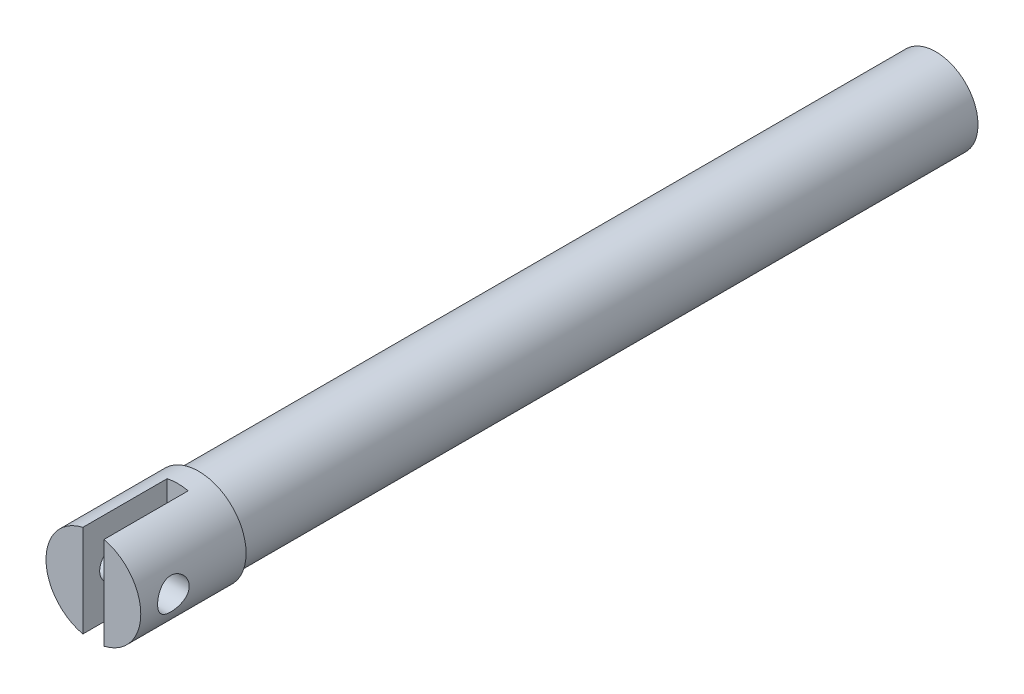
ISO-10303-21;
HEADER;
FILE_DESCRIPTION(('STEP AP214'),'2;1');
FILE_NAME('part.step','',(''),(''),'','','');
FILE_SCHEMA(('AUTOMOTIVE_DESIGN { 1 0 10303 214 1 1 1 1 }'));
ENDSEC;
DATA;
#1=APPLICATION_CONTEXT('core data for automotive mechanical design processes');
#2=APPLICATION_PROTOCOL_DEFINITION('international standard','automotive_design',2000,#1);
#3=PRODUCT_CONTEXT('',#1,'mechanical');
#4=PRODUCT('Part','Part','',(#3));
#5=PRODUCT_RELATED_PRODUCT_CATEGORY('part','',(#4));
#6=PRODUCT_DEFINITION_FORMATION('','',#4);
#7=PRODUCT_DEFINITION_CONTEXT('part definition',#1,'design');
#8=PRODUCT_DEFINITION('design','',#6,#7);
#9=PRODUCT_DEFINITION_SHAPE('','',#8);
#10=(LENGTH_UNIT() NAMED_UNIT(*) SI_UNIT(.MILLI.,.METRE.));
#11=(NAMED_UNIT(*) PLANE_ANGLE_UNIT() SI_UNIT($,.RADIAN.));
#12=(NAMED_UNIT(*) SI_UNIT($,.STERADIAN.) SOLID_ANGLE_UNIT());
#13=UNCERTAINTY_MEASURE_WITH_UNIT(LENGTH_MEASURE(1.E-05),#10,'distance_accuracy_value','');
#14=(GEOMETRIC_REPRESENTATION_CONTEXT(3) GLOBAL_UNCERTAINTY_ASSIGNED_CONTEXT((#13)) GLOBAL_UNIT_ASSIGNED_CONTEXT((#10,
#11,#12)) REPRESENTATION_CONTEXT('',''));
#15=CARTESIAN_POINT('',(0.,0.,0.));
#16=DIRECTION('',(0.,0.,1.));
#17=DIRECTION('',(1.,0.,0.));
#18=AXIS2_PLACEMENT_3D('',#15,#16,#17);
#19=CARTESIAN_POINT('',(0.,0.,70.));
#20=DIRECTION('',(0.,0.,1.));
#21=DIRECTION('',(1.,0.,0.));
#22=AXIS2_PLACEMENT_3D('',#19,#20,#21);
#23=CYLINDRICAL_SURFACE('',#22,4.5);
#24=CARTESIAN_POINT('',(-4.5,0.,75.4014187719392));
#25=CARTESIAN_POINT('',(-4.50000022951416,-0.0818450443300849,75.4014183913418));
#26=CARTESIAN_POINT('',(-4.49774654261317,-0.163687791807825,75.4081391711301));
#27=CARTESIAN_POINT('',(-4.48897815304921,-0.324962641309459,75.4347624351651));
#28=CARTESIAN_POINT('',(-4.48246300803229,-0.404394492178227,75.4546662878626));
#29=CARTESIAN_POINT('',(-4.46587961859664,-0.558499184252665,75.5068976370153));
#30=CARTESIAN_POINT('',(-4.4558173159628,-0.633179738829053,75.5392043656281));
#31=CARTESIAN_POINT('',(-4.43316668576013,-0.776062405207988,75.6152305311968));
#32=CARTESIAN_POINT('',(-4.42057786001667,-0.844263235438059,75.6589522194432));
#33=CARTESIAN_POINT('',(-4.39371141664507,-0.9746125125334,75.7581574792274));
#34=CARTESIAN_POINT('',(-4.37939334695677,-1.03650555044747,75.81396562333));
#35=CARTESIAN_POINT('',(-4.35090472174682,-1.15024903905313,75.9350695039991));
#36=CARTESIAN_POINT('',(-4.33673419935823,-1.20209727823419,76.000367324332));
#37=CARTESIAN_POINT('',(-4.30969998715911,-1.29573741334179,76.1408964447339));
#38=CARTESIAN_POINT('',(-4.29688558913532,-1.33719728733155,76.2163593815374));
#39=CARTESIAN_POINT('',(-4.27462958127902,-1.40672831081658,76.3736829136271));
#40=CARTESIAN_POINT('',(-4.26518694241118,-1.43480354608014,76.4555415476833));
#41=CARTESIAN_POINT('',(-4.25116954904066,-1.47581019226374,76.6204286041843));
#42=CARTESIAN_POINT('',(-4.24644143654417,-1.48922017240765,76.7033245846728));
#43=CARTESIAN_POINT('',(-4.24193484944261,-1.50201168500171,76.8703144031731));
#44=CARTESIAN_POINT('',(-4.24215484534095,-1.50139755240707,76.954407863003));
#45=CARTESIAN_POINT('',(-4.2473852251227,-1.48652985555512,77.1173237176053));
#46=CARTESIAN_POINT('',(-4.25217623801299,-1.47290086975049,77.1962113763178));
#47=CARTESIAN_POINT('',(-4.26564986586826,-1.43340924427412,77.3505089013495));
#48=CARTESIAN_POINT('',(-4.27433294676161,-1.4075451398878,77.4259183500918));
#49=CARTESIAN_POINT('',(-4.29476866696873,-1.34390858709032,77.5725378963265));
#50=CARTESIAN_POINT('',(-4.30656848689676,-1.30595107306089,77.6436608101435));
#51=CARTESIAN_POINT('',(-4.3318883786359,-1.21933365945471,77.7787251343588));
#52=CARTESIAN_POINT('',(-4.34540894685695,-1.17067066854601,77.8426644623393));
#53=CARTESIAN_POINT('',(-4.37350993751611,-1.06102399902336,77.9650561691804));
#54=CARTESIAN_POINT('',(-4.38810884032264,-0.99952972511447,78.0230478137028));
#55=CARTESIAN_POINT('',(-4.41610407580555,-0.867509354955093,78.1280156719343));
#56=CARTESIAN_POINT('',(-4.42950029307101,-0.796982393491217,78.174990829186));
#57=CARTESIAN_POINT('',(-4.45375661906691,-0.647921419569393,78.2569632222918));
#58=CARTESIAN_POINT('',(-4.46459025012059,-0.569314914624495,78.2918370089503));
#59=CARTESIAN_POINT('',(-4.48230850716652,-0.406903625046752,78.3477235328728));
#60=CARTESIAN_POINT('',(-4.48919450482319,-0.323100657232423,78.3687410850744));
#61=CARTESIAN_POINT('',(-4.49801440607161,-0.156575744293951,78.3955022709728));
#62=CARTESIAN_POINT('',(-4.50015002750592,-0.0739643997972646,78.4018684856984));
#63=CARTESIAN_POINT('',(-4.49983354042241,0.0911626049403602,78.4009197615415));
#64=CARTESIAN_POINT('',(-4.49738220629043,0.173678278979479,78.3936071319694));
#65=CARTESIAN_POINT('',(-4.48830037075656,0.333779799456385,78.3660009103353));
#66=CARTESIAN_POINT('',(-4.48179298066788,0.411439210252266,78.346089462865));
#67=CARTESIAN_POINT('',(-4.46537770245105,0.562283937869361,78.2943286052391));
#68=CARTESIAN_POINT('',(-4.45546938070013,0.635468682762911,78.2624776727376));
#69=CARTESIAN_POINT('',(-4.43293396930935,0.77743244458991,78.186813124178));
#70=CARTESIAN_POINT('',(-4.42024222133679,0.846044938825718,78.1427068820145));
#71=CARTESIAN_POINT('',(-4.39357880874394,0.975097245203378,78.044127546919));
#72=CARTESIAN_POINT('',(-4.37960675390741,1.03553455169337,77.9896512878916));
#73=CARTESIAN_POINT('',(-4.35115271970667,1.14937876170945,77.8689506454294));
#74=CARTESIAN_POINT('',(-4.33667641631142,1.20234145386865,77.8023049315489));
#75=CARTESIAN_POINT('',(-4.30949959942063,1.29638628348536,77.6607614202229));
#76=CARTESIAN_POINT('',(-4.29679910073004,1.33746832189652,77.5858635539881));
#77=CARTESIAN_POINT('',(-4.27473587687075,1.40639539562454,77.4299092490044));
#78=CARTESIAN_POINT('',(-4.26536641189468,1.43426719824753,77.3488656531861));
#79=CARTESIAN_POINT('',(-4.25116248459674,1.47584200013903,77.182850796873));
#80=CARTESIAN_POINT('',(-4.24632597935459,1.48955138243091,77.0978813238327));
#81=CARTESIAN_POINT('',(-4.24196788311266,1.50191442371601,76.9311231278779));
#82=CARTESIAN_POINT('',(-4.24218600386123,1.5013053859626,76.849395261509));
#83=CARTESIAN_POINT('',(-4.24726904735801,1.48686344017304,76.6872711595561));
#84=CARTESIAN_POINT('',(-4.25213369354043,1.47303131918787,76.6068748450066));
#85=CARTESIAN_POINT('',(-4.26576786457338,1.43305771969401,76.4512152774355));
#86=CARTESIAN_POINT('',(-4.27446147033717,1.40715501902326,76.3758835344325));
#87=CARTESIAN_POINT('',(-4.29474598227703,1.34396904863961,76.2305776615318));
#88=CARTESIAN_POINT('',(-4.3063375314509,1.3066832528307,76.1606047251572));
#89=CARTESIAN_POINT('',(-4.33174243839069,1.21989103887514,76.0246932670549));
#90=CARTESIAN_POINT('',(-4.34563067463206,1.16992236414686,75.9590640190917));
#91=CARTESIAN_POINT('',(-4.37375034424879,1.05996432470347,75.8368840518629));
#92=CARTESIAN_POINT('',(-4.38798187368559,0.999972126677219,75.7803359084071));
#93=CARTESIAN_POINT('',(-4.41585045788316,0.86886233538103,75.6757021535055));
#94=CARTESIAN_POINT('',(-4.42944272701885,0.79740227024959,75.6280322503127));
#95=CARTESIAN_POINT('',(-4.45388986758918,0.647036036109931,75.5454331286633));
#96=CARTESIAN_POINT('',(-4.46474543861895,0.568131777198515,75.5105006530562));
#97=CARTESIAN_POINT('',(-4.48208272602813,0.408740470801455,75.4558363232062));
#98=CARTESIAN_POINT('',(-4.48873818633784,0.328481636514606,75.4354950725442));
#99=CARTESIAN_POINT('',(-4.49769610596333,0.165480624015367,75.4082883509235));
#100=CARTESIAN_POINT('',(-4.49999976797857,0.0827391383531179,75.4014191566944));
#101=CARTESIAN_POINT('',(-4.5,0.,75.4014187719392));
#102=B_SPLINE_CURVE_WITH_KNOTS('',3,(#24,#25,#26,#27,#28,#29,#30,#31,#32,#33,#34,#35,#36,#37,
#38,#39,#40,#41,#42,#43,#44,#45,#46,#47,#48,#49,#50,#51,#52,#53,#54,#55,#56,#57,#58,#59,#60,#61,
#62,#63,#64,#65,#66,#67,#68,#69,#70,#71,#72,#73,#74,#75,#76,#77,#78,#79,#80,#81,#82,#83,#84,#85,
#86,#87,#88,#89,#90,#91,#92,#93,#94,#95,#96,#97,#98,#99,#100,#101),.UNSPECIFIED.,.T.,.F.,(4,2,2,
2,2,2,2,2,2,2,2,2,2,2,2,2,2,2,2,2,2,2,2,2,2,2,2,2,2,2,2,2,2,2,2,2,2,2,4),(0.,0.245230659039017,
0.490486777901282,0.735334009305413,0.980229566698657,1.23277026424134,1.48536649931295,
1.74522577235206,2.0050056703925,2.25602888612761,2.50697450981229,2.74645239826921,
2.98595896283222,3.22932256732695,3.47275653837309,3.72889958717049,3.98506718949927,
4.24377608475536,4.50239503315812,4.74980374762754,4.99717069746265,5.23737236967319,
5.47760467926155,5.72415599765604,5.97078271232836,6.22861534321126,6.48645012352494,
6.74376020740154,7.0009542705876,7.24493499096386,7.48890119027063,7.72823380620626,
7.96761957263967,8.21745100037706,8.46735316685668,8.72699491252649,8.98657021728684,
9.2345483756072,9.48245799057208),.UNSPECIFIED.);
#103=CARTESIAN_POINT('',(-4.5,0.,75.4014187719392));
#104=VERTEX_POINT('',#103);
#105=EDGE_CURVE('E116',#104,#104,#102,.T.);
#106=ORIENTED_EDGE('',*,*,#105,.F.);
#107=EDGE_LOOP('',(#106));
#108=FACE_BOUND('',#107,.T.);
#109=CARTESIAN_POINT('',(4.5,0.,75.4014187719392));
#110=CARTESIAN_POINT('',(4.50000022951416,0.0818450443300849,75.4014183913418));
#111=CARTESIAN_POINT('',(4.49774654261317,0.163687791807825,75.4081391711301));
#112=CARTESIAN_POINT('',(4.48897815304921,0.324962641309459,75.4347624351651));
#113=CARTESIAN_POINT('',(4.48246300803229,0.404394492178227,75.4546662878626));
#114=CARTESIAN_POINT('',(4.46587961859664,0.558499184252665,75.5068976370153));
#115=CARTESIAN_POINT('',(4.4558173159628,0.633179738829053,75.5392043656281));
#116=CARTESIAN_POINT('',(4.43316668576013,0.776062405207988,75.6152305311968));
#117=CARTESIAN_POINT('',(4.42057786001667,0.844263235438059,75.6589522194432));
#118=CARTESIAN_POINT('',(4.39371141664507,0.9746125125334,75.7581574792274));
#119=CARTESIAN_POINT('',(4.37939334695677,1.03650555044747,75.81396562333));
#120=CARTESIAN_POINT('',(4.35090472174682,1.15024903905313,75.9350695039991));
#121=CARTESIAN_POINT('',(4.33673419935823,1.20209727823419,76.000367324332));
#122=CARTESIAN_POINT('',(4.30969998715911,1.29573741334179,76.1408964447339));
#123=CARTESIAN_POINT('',(4.29688558913532,1.33719728733155,76.2163593815374));
#124=CARTESIAN_POINT('',(4.27462958127902,1.40672831081658,76.3736829136271));
#125=CARTESIAN_POINT('',(4.26518694241118,1.43480354608014,76.4555415476833));
#126=CARTESIAN_POINT('',(4.25116954904066,1.47581019226374,76.6204286041843));
#127=CARTESIAN_POINT('',(4.24644143654417,1.48922017240765,76.7033245846728));
#128=CARTESIAN_POINT('',(4.24193484944261,1.50201168500171,76.8703144031731));
#129=CARTESIAN_POINT('',(4.24215484534095,1.50139755240707,76.954407863003));
#130=CARTESIAN_POINT('',(4.2473852251227,1.48652985555512,77.1173237176053));
#131=CARTESIAN_POINT('',(4.25217623801299,1.47290086975049,77.1962113763178));
#132=CARTESIAN_POINT('',(4.26564986586826,1.43340924427412,77.3505089013495));
#133=CARTESIAN_POINT('',(4.27433294676161,1.4075451398878,77.4259183500918));
#134=CARTESIAN_POINT('',(4.29476866696873,1.34390858709032,77.5725378963265));
#135=CARTESIAN_POINT('',(4.30656848689676,1.30595107306089,77.6436608101435));
#136=CARTESIAN_POINT('',(4.3318883786359,1.21933365945471,77.7787251343588));
#137=CARTESIAN_POINT('',(4.34540894685695,1.17067066854601,77.8426644623393));
#138=CARTESIAN_POINT('',(4.37350993751611,1.06102399902336,77.9650561691804));
#139=CARTESIAN_POINT('',(4.38810884032264,0.99952972511447,78.0230478137028));
#140=CARTESIAN_POINT('',(4.41610407580555,0.867509354955093,78.1280156719343));
#141=CARTESIAN_POINT('',(4.42950029307101,0.796982393491217,78.174990829186));
#142=CARTESIAN_POINT('',(4.45375661906691,0.647921419569393,78.2569632222918));
#143=CARTESIAN_POINT('',(4.46459025012059,0.569314914624495,78.2918370089503));
#144=CARTESIAN_POINT('',(4.48230850716652,0.406903625046752,78.3477235328728));
#145=CARTESIAN_POINT('',(4.48919450482319,0.323100657232423,78.3687410850744));
#146=CARTESIAN_POINT('',(4.49801440607161,0.156575744293951,78.3955022709728));
#147=CARTESIAN_POINT('',(4.50015002750592,0.0739643997972646,78.4018684856984));
#148=CARTESIAN_POINT('',(4.49983354042241,-0.0911626049403602,78.4009197615415));
#149=CARTESIAN_POINT('',(4.49738220629043,-0.173678278979479,78.3936071319694));
#150=CARTESIAN_POINT('',(4.48830037075656,-0.333779799456385,78.3660009103353));
#151=CARTESIAN_POINT('',(4.48179298066788,-0.411439210252266,78.346089462865));
#152=CARTESIAN_POINT('',(4.46537770245105,-0.562283937869361,78.2943286052391));
#153=CARTESIAN_POINT('',(4.45546938070013,-0.635468682762911,78.2624776727376));
#154=CARTESIAN_POINT('',(4.43293396930935,-0.77743244458991,78.186813124178));
#155=CARTESIAN_POINT('',(4.42024222133679,-0.846044938825718,78.1427068820145));
#156=CARTESIAN_POINT('',(4.39357880874394,-0.975097245203378,78.044127546919));
#157=CARTESIAN_POINT('',(4.37960675390741,-1.03553455169337,77.9896512878916));
#158=CARTESIAN_POINT('',(4.35115271970667,-1.14937876170945,77.8689506454294));
#159=CARTESIAN_POINT('',(4.33667641631142,-1.20234145386865,77.8023049315489));
#160=CARTESIAN_POINT('',(4.30949959942063,-1.29638628348536,77.6607614202229));
#161=CARTESIAN_POINT('',(4.29679910073004,-1.33746832189652,77.5858635539881));
#162=CARTESIAN_POINT('',(4.27473587687075,-1.40639539562454,77.4299092490044));
#163=CARTESIAN_POINT('',(4.26536641189468,-1.43426719824753,77.3488656531861));
#164=CARTESIAN_POINT('',(4.25116248459674,-1.47584200013903,77.182850796873));
#165=CARTESIAN_POINT('',(4.24632597935459,-1.48955138243091,77.0978813238327));
#166=CARTESIAN_POINT('',(4.24196788311266,-1.50191442371601,76.9311231278779));
#167=CARTESIAN_POINT('',(4.24218600386123,-1.5013053859626,76.849395261509));
#168=CARTESIAN_POINT('',(4.24726904735801,-1.48686344017304,76.6872711595561));
#169=CARTESIAN_POINT('',(4.25213369354043,-1.47303131918787,76.6068748450066));
#170=CARTESIAN_POINT('',(4.26576786457338,-1.43305771969401,76.4512152774355));
#171=CARTESIAN_POINT('',(4.27446147033717,-1.40715501902326,76.3758835344325));
#172=CARTESIAN_POINT('',(4.29474598227703,-1.34396904863961,76.2305776615318));
#173=CARTESIAN_POINT('',(4.3063375314509,-1.3066832528307,76.1606047251572));
#174=CARTESIAN_POINT('',(4.33174243839069,-1.21989103887514,76.0246932670549));
#175=CARTESIAN_POINT('',(4.34563067463206,-1.16992236414686,75.9590640190917));
#176=CARTESIAN_POINT('',(4.37375034424879,-1.05996432470347,75.8368840518629));
#177=CARTESIAN_POINT('',(4.38798187368559,-0.999972126677219,75.7803359084071));
#178=CARTESIAN_POINT('',(4.41585045788316,-0.86886233538103,75.6757021535055));
#179=CARTESIAN_POINT('',(4.42944272701885,-0.79740227024959,75.6280322503127));
#180=CARTESIAN_POINT('',(4.45388986758918,-0.647036036109931,75.5454331286633));
#181=CARTESIAN_POINT('',(4.46474543861895,-0.568131777198515,75.5105006530562));
#182=CARTESIAN_POINT('',(4.48208272602813,-0.408740470801455,75.4558363232062));
#183=CARTESIAN_POINT('',(4.48873818633784,-0.328481636514606,75.4354950725442));
#184=CARTESIAN_POINT('',(4.49769610596333,-0.165480624015367,75.4082883509235));
#185=CARTESIAN_POINT('',(4.49999976797857,-0.0827391383531179,75.4014191566944));
#186=CARTESIAN_POINT('',(4.5,0.,75.4014187719392));
#187=B_SPLINE_CURVE_WITH_KNOTS('',3,(#109,#110,#111,#112,#113,#114,#115,#116,#117,#118,#119,
#120,#121,#122,#123,#124,#125,#126,#127,#128,#129,#130,#131,#132,#133,#134,#135,#136,#137,#138,
#139,#140,#141,#142,#143,#144,#145,#146,#147,#148,#149,#150,#151,#152,#153,#154,#155,#156,#157,
#158,#159,#160,#161,#162,#163,#164,#165,#166,#167,#168,#169,#170,#171,#172,#173,#174,#175,#176,
#177,#178,#179,#180,#181,#182,#183,#184,#185,#186),.UNSPECIFIED.,.T.,.F.,(4,2,2,2,2,2,2,2,2,2,2,
2,2,2,2,2,2,2,2,2,2,2,2,2,2,2,2,2,2,2,2,2,2,2,2,2,2,2,4),(0.,0.245230659039017,
0.490486777901282,0.735334009305413,0.980229566698657,1.23277026424134,1.48536649931295,
1.74522577235206,2.0050056703925,2.25602888612761,2.50697450981229,2.74645239826921,
2.98595896283222,3.22932256732695,3.47275653837309,3.72889958717049,3.98506718949927,
4.24377608475536,4.50239503315812,4.74980374762754,4.99717069746265,5.23737236967319,
5.47760467926155,5.72415599765604,5.97078271232836,6.22861534321126,6.48645012352494,
6.74376020740154,7.0009542705876,7.24493499096386,7.48890119027063,7.72823380620626,
7.96761957263967,8.21745100037706,8.46735316685668,8.72699491252649,8.98657021728684,
9.2345483756072,9.48245799057208),.UNSPECIFIED.);
#188=CARTESIAN_POINT('',(4.5,0.,75.4014187719392));
#189=VERTEX_POINT('',#188);
#190=EDGE_CURVE('E123',#189,#189,#187,.T.);
#191=ORIENTED_EDGE('',*,*,#190,.F.);
#192=EDGE_LOOP('',(#191));
#193=FACE_BOUND('',#192,.T.);
#194=CARTESIAN_POINT('',(0.,0.,70.));
#195=DIRECTION('',(0.,0.,1.));
#196=DIRECTION('',(1.,0.,0.));
#197=AXIS2_PLACEMENT_3D('',#194,#195,#196);
#198=CIRCLE('',#197,4.5);
#199=CARTESIAN_POINT('',(4.5,0.,70.));
#200=VERTEX_POINT('',#199);
#201=EDGE_CURVE('E94',#200,#200,#198,.T.);
#202=ORIENTED_EDGE('',*,*,#201,.T.);
#203=EDGE_LOOP('',(#202));
#204=FACE_BOUND('',#203,.T.);
#205=CARTESIAN_POINT('',(0.,0.,72.));
#206=DIRECTION('',(0.,0.,1.));
#207=DIRECTION('',(1.,0.,0.));
#208=AXIS2_PLACEMENT_3D('',#205,#206,#207);
#209=CIRCLE('',#208,4.5);
#210=CARTESIAN_POINT('',(1.,-4.38748219369606,72.));
#211=VERTEX_POINT('',#210);
#212=CARTESIAN_POINT('',(-0.999999999999998,-4.38748219369606,72.));
#213=VERTEX_POINT('',#212);
#214=EDGE_CURVE('E11',#211,#213,#209,.F.);
#215=ORIENTED_EDGE('',*,*,#214,.T.);
#216=DIRECTION('',(0.,0.,1.));
#217=VECTOR('',#216,1.);
#218=CARTESIAN_POINT('',(-0.999999999999998,-4.38748219369606,70.));
#219=LINE('',#218,#217);
#220=CARTESIAN_POINT('',(-0.999999999999998,-4.38748219369606,80.));
#221=VERTEX_POINT('',#220);
#222=EDGE_CURVE('E87',#213,#221,#219,.T.);
#223=ORIENTED_EDGE('',*,*,#222,.T.);
#224=CARTESIAN_POINT('',(0.,0.,80.));
#225=DIRECTION('',(0.,0.,1.));
#226=DIRECTION('',(1.,0.,0.));
#227=AXIS2_PLACEMENT_3D('',#224,#225,#226);
#228=CIRCLE('',#227,4.5);
#229=CARTESIAN_POINT('',(-0.999999999999998,4.38748219369606,80.));
#230=VERTEX_POINT('',#229);
#231=EDGE_CURVE('E90',#230,#221,#228,.T.);
#232=ORIENTED_EDGE('',*,*,#231,.F.);
#233=DIRECTION('',(0.,0.,1.));
#234=VECTOR('',#233,1.);
#235=CARTESIAN_POINT('',(-0.999999999999998,4.38748219369606,70.));
#236=LINE('',#235,#234);
#237=CARTESIAN_POINT('',(-0.999999999999998,4.38748219369606,72.));
#238=VERTEX_POINT('',#237);
#239=EDGE_CURVE('E91',#230,#238,#236,.F.);
#240=ORIENTED_EDGE('',*,*,#239,.T.);
#241=CARTESIAN_POINT('',(1.,4.38748219369606,72.));
#242=VERTEX_POINT('',#241);
#243=EDGE_CURVE('E42',#238,#242,#209,.F.);
#244=ORIENTED_EDGE('',*,*,#243,.T.);
#245=DIRECTION('',(0.,0.,1.));
#246=VECTOR('',#245,1.);
#247=CARTESIAN_POINT('',(1.,4.38748219369606,70.));
#248=LINE('',#247,#246);
#249=CARTESIAN_POINT('',(1.,4.38748219369606,80.));
#250=VERTEX_POINT('',#249);
#251=EDGE_CURVE('E77',#250,#242,#248,.F.);
#252=ORIENTED_EDGE('',*,*,#251,.F.);
#253=CARTESIAN_POINT('',(1.,-4.38748219369606,80.));
#254=VERTEX_POINT('',#253);
#255=EDGE_CURVE('E85',#254,#250,#228,.T.);
#256=ORIENTED_EDGE('',*,*,#255,.F.);
#257=DIRECTION('',(0.,0.,1.));
#258=VECTOR('',#257,1.);
#259=CARTESIAN_POINT('',(1.,-4.38748219369606,70.));
#260=LINE('',#259,#258);
#261=EDGE_CURVE('E49',#211,#254,#260,.T.);
#262=ORIENTED_EDGE('',*,*,#261,.F.);
#263=EDGE_LOOP('',(#215,#223,#232,#240,#244,#252,#256,#262));
#264=FACE_BOUND('',#263,.T.);
#265=ADVANCED_FACE('F33',(#108,#193,#204,#264),#23,.T.);
#266=CARTESIAN_POINT('',(0.,0.,80.));
#267=DIRECTION('',(0.,0.,1.));
#268=DIRECTION('',(1.,0.,0.));
#269=AXIS2_PLACEMENT_3D('',#266,#267,#268);
#270=PLANE('',#269);
#271=ORIENTED_EDGE('',*,*,#231,.T.);
#272=DIRECTION('',(0.,1.,0.));
#273=VECTOR('',#272,1.);
#274=CARTESIAN_POINT('',(-0.999999999999998,0.,80.));
#275=LINE('',#274,#273);
#276=EDGE_CURVE('E81',#221,#230,#275,.T.);
#277=ORIENTED_EDGE('',*,*,#276,.T.);
#278=EDGE_LOOP('',(#271,#277));
#279=FACE_BOUND('',#278,.T.);
#280=ADVANCED_FACE('F106',(#279),#270,.T.);
#281=CARTESIAN_POINT('',(0.,0.,80.));
#282=DIRECTION('',(0.,0.,-1.));
#283=DIRECTION('',(-1.,0.,0.));
#284=AXIS2_PLACEMENT_3D('',#281,#282,#283);
#285=CYLINDRICAL_SURFACE('',#284,4.);
#286=CARTESIAN_POINT('',(0.,0.,0.));
#287=DIRECTION('',(0.,0.,1.));
#288=DIRECTION('',(1.,0.,0.));
#289=AXIS2_PLACEMENT_3D('',#286,#287,#288);
#290=CIRCLE('',#289,4.);
#291=CARTESIAN_POINT('',(4.,0.,0.));
#292=VERTEX_POINT('',#291);
#293=EDGE_CURVE('E98',#292,#292,#290,.T.);
#294=ORIENTED_EDGE('',*,*,#293,.T.);
#295=EDGE_LOOP('',(#294));
#296=FACE_BOUND('',#295,.T.);
#297=CARTESIAN_POINT('',(0.,0.,70.));
#298=DIRECTION('',(0.,0.,1.));
#299=DIRECTION('',(1.,0.,0.));
#300=AXIS2_PLACEMENT_3D('',#297,#298,#299);
#301=CIRCLE('',#300,4.);
#302=CARTESIAN_POINT('',(4.,0.,70.));
#303=VERTEX_POINT('',#302);
#304=EDGE_CURVE('E82',#303,#303,#301,.T.);
#305=ORIENTED_EDGE('',*,*,#304,.F.);
#306=EDGE_LOOP('',(#305));
#307=FACE_BOUND('',#306,.T.);
#308=ADVANCED_FACE('F35',(#296,#307),#285,.T.);
#309=CARTESIAN_POINT('',(0.,0.,0.));
#310=DIRECTION('',(0.,0.,1.));
#311=DIRECTION('',(1.,0.,0.));
#312=AXIS2_PLACEMENT_3D('',#309,#310,#311);
#313=PLANE('',#312);
#314=ORIENTED_EDGE('',*,*,#293,.F.);
#315=EDGE_LOOP('',(#314));
#316=FACE_BOUND('',#315,.T.);
#317=ADVANCED_FACE('F148',(#316),#313,.F.);
#318=CARTESIAN_POINT('',(0.,0.,70.));
#319=DIRECTION('',(0.,0.,1.));
#320=DIRECTION('',(1.,0.,0.));
#321=AXIS2_PLACEMENT_3D('',#318,#319,#320);
#322=PLANE('',#321);
#323=ORIENTED_EDGE('',*,*,#304,.T.);
#324=EDGE_LOOP('',(#323));
#325=FACE_BOUND('',#324,.T.);
#326=ORIENTED_EDGE('',*,*,#201,.F.);
#327=EDGE_LOOP('',(#326));
#328=FACE_BOUND('',#327,.T.);
#329=ADVANCED_FACE('F146',(#325,#328),#322,.F.);
#330=DIRECTION('',(0.,1.,0.));
#331=VECTOR('',#330,1.);
#332=CARTESIAN_POINT('',(1.,0.,80.));
#333=LINE('',#332,#331);
#334=EDGE_CURVE('E74',#254,#250,#333,.T.);
#335=ORIENTED_EDGE('',*,*,#334,.F.);
#336=ORIENTED_EDGE('',*,*,#255,.T.);
#337=EDGE_LOOP('',(#335,#336));
#338=FACE_BOUND('',#337,.T.);
#339=ADVANCED_FACE('F89',(#338),#270,.T.);
#340=CARTESIAN_POINT('',(-0.999999999999998,0.,72.));
#341=DIRECTION('',(1.,0.,0.));
#342=DIRECTION('',(0.,0.,-1.));
#343=AXIS2_PLACEMENT_3D('',#340,#341,#342);
#344=PLANE('',#343);
#345=CARTESIAN_POINT('',(-0.999999999999998,0.,76.9014187719392));
#346=DIRECTION('',(1.,0.,0.));
#347=DIRECTION('',(0.,0.,-1.));
#348=AXIS2_PLACEMENT_3D('',#345,#346,#347);
#349=CIRCLE('',#348,1.5);
#350=CARTESIAN_POINT('',(-0.999999999999998,0.,75.4014187719392));
#351=VERTEX_POINT('',#350);
#352=EDGE_CURVE('E169',#351,#351,#349,.T.);
#353=ORIENTED_EDGE('',*,*,#352,.F.);
#354=EDGE_LOOP('',(#353));
#355=FACE_BOUND('',#354,.T.);
#356=ORIENTED_EDGE('',*,*,#276,.F.);
#357=ORIENTED_EDGE('',*,*,#222,.F.);
#358=DIRECTION('',(0.,1.,0.));
#359=VECTOR('',#358,1.);
#360=CARTESIAN_POINT('',(-0.999999999999998,0.,72.));
#361=LINE('',#360,#359);
#362=EDGE_CURVE('E114',#213,#238,#361,.T.);
#363=ORIENTED_EDGE('',*,*,#362,.T.);
#364=ORIENTED_EDGE('',*,*,#239,.F.);
#365=EDGE_LOOP('',(#356,#357,#363,#364));
#366=FACE_BOUND('',#365,.T.);
#367=ADVANCED_FACE('F142',(#355,#366),#344,.T.);
#368=CARTESIAN_POINT('',(1.,0.,72.));
#369=DIRECTION('',(1.,0.,0.));
#370=DIRECTION('',(0.,0.,-1.));
#371=AXIS2_PLACEMENT_3D('',#368,#369,#370);
#372=PLANE('',#371);
#373=CARTESIAN_POINT('',(1.,0.,76.9014187719392));
#374=DIRECTION('',(1.,0.,0.));
#375=DIRECTION('',(0.,0.,-1.));
#376=AXIS2_PLACEMENT_3D('',#373,#374,#375);
#377=CIRCLE('',#376,1.5);
#378=CARTESIAN_POINT('',(1.,0.,75.4014187719392));
#379=VERTEX_POINT('',#378);
#380=EDGE_CURVE('E37',#379,#379,#377,.T.);
#381=ORIENTED_EDGE('',*,*,#380,.T.);
#382=EDGE_LOOP('',(#381));
#383=FACE_BOUND('',#382,.T.);
#384=ORIENTED_EDGE('',*,*,#251,.T.);
#385=DIRECTION('',(0.,1.,0.));
#386=VECTOR('',#385,1.);
#387=CARTESIAN_POINT('',(1.,0.,72.));
#388=LINE('',#387,#386);
#389=EDGE_CURVE('E112',#211,#242,#388,.T.);
#390=ORIENTED_EDGE('',*,*,#389,.F.);
#391=ORIENTED_EDGE('',*,*,#261,.T.);
#392=ORIENTED_EDGE('',*,*,#334,.T.);
#393=EDGE_LOOP('',(#384,#390,#391,#392));
#394=FACE_BOUND('',#393,.T.);
#395=ADVANCED_FACE('F76',(#383,#394),#372,.F.);
#396=CARTESIAN_POINT('',(0.,0.,72.));
#397=DIRECTION('',(0.,0.,1.));
#398=DIRECTION('',(1.,0.,0.));
#399=AXIS2_PLACEMENT_3D('',#396,#397,#398);
#400=PLANE('',#399);
#401=ORIENTED_EDGE('',*,*,#389,.T.);
#402=ORIENTED_EDGE('',*,*,#243,.F.);
#403=ORIENTED_EDGE('',*,*,#362,.F.);
#404=ORIENTED_EDGE('',*,*,#214,.F.);
#405=EDGE_LOOP('',(#401,#402,#403,#404));
#406=FACE_BOUND('',#405,.T.);
#407=ADVANCED_FACE('F136',(#406),#400,.T.);
#408=CARTESIAN_POINT('',(-4.5,0.,76.9014187719392));
#409=DIRECTION('',(1.,0.,0.));
#410=DIRECTION('',(0.,0.,-1.));
#411=AXIS2_PLACEMENT_3D('',#408,#409,#410);
#412=CYLINDRICAL_SURFACE('',#411,1.5);
#413=ORIENTED_EDGE('',*,*,#190,.T.);
#414=EDGE_LOOP('',(#413));
#415=FACE_BOUND('',#414,.T.);
#416=ORIENTED_EDGE('',*,*,#380,.F.);
#417=EDGE_LOOP('',(#416));
#418=FACE_BOUND('',#417,.T.);
#419=ADVANCED_FACE('F134',(#415,#418),#412,.F.);
#420=ORIENTED_EDGE('',*,*,#105,.T.);
#421=EDGE_LOOP('',(#420));
#422=FACE_BOUND('',#421,.T.);
#423=ORIENTED_EDGE('',*,*,#352,.T.);
#424=EDGE_LOOP('',(#423));
#425=FACE_BOUND('',#424,.T.);
#426=ADVANCED_FACE('F130',(#422,#425),#412,.F.);
#427=CLOSED_SHELL('',(#265,#280,#308,#317,#329,#339,#367,#395,#407,#419,#426));
#428=MANIFOLD_SOLID_BREP('B2',#427);
#429=ADVANCED_BREP_SHAPE_REPRESENTATION('',(#18,#428),#14);
#430=SHAPE_DEFINITION_REPRESENTATION(#9,#429);
ENDSEC;
END-ISO-10303-21;
